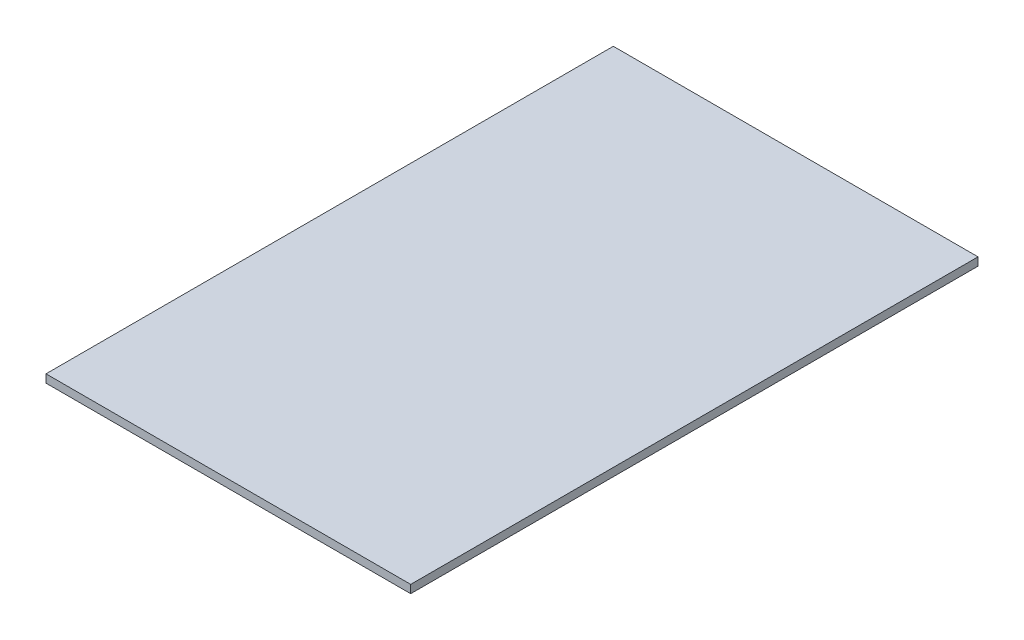
ISO-10303-21;
HEADER;
FILE_DESCRIPTION(('STEP AP214'),'2;1');
FILE_NAME('part.step','',(''),(''),'','','');
FILE_SCHEMA(('AUTOMOTIVE_DESIGN { 1 0 10303 214 1 1 1 1 }'));
ENDSEC;
DATA;
#1=APPLICATION_CONTEXT('core data for automotive mechanical design processes');
#2=APPLICATION_PROTOCOL_DEFINITION('international standard','automotive_design',2000,#1);
#3=PRODUCT_CONTEXT('',#1,'mechanical');
#4=PRODUCT('Part','Part','',(#3));
#5=PRODUCT_RELATED_PRODUCT_CATEGORY('part','',(#4));
#6=PRODUCT_DEFINITION_FORMATION('','',#4);
#7=PRODUCT_DEFINITION_CONTEXT('part definition',#1,'design');
#8=PRODUCT_DEFINITION('design','',#6,#7);
#9=PRODUCT_DEFINITION_SHAPE('','',#8);
#10=(LENGTH_UNIT() NAMED_UNIT(*) SI_UNIT(.MILLI.,.METRE.));
#11=(NAMED_UNIT(*) PLANE_ANGLE_UNIT() SI_UNIT($,.RADIAN.));
#12=(NAMED_UNIT(*) SI_UNIT($,.STERADIAN.) SOLID_ANGLE_UNIT());
#13=UNCERTAINTY_MEASURE_WITH_UNIT(LENGTH_MEASURE(1.E-05),#10,'distance_accuracy_value','');
#14=(GEOMETRIC_REPRESENTATION_CONTEXT(3) GLOBAL_UNCERTAINTY_ASSIGNED_CONTEXT((#13)) GLOBAL_UNIT_ASSIGNED_CONTEXT((#10,
#11,#12)) REPRESENTATION_CONTEXT('',''));
#15=CARTESIAN_POINT('',(0.,0.,0.));
#16=DIRECTION('',(0.,0.,1.));
#17=DIRECTION('',(1.,0.,0.));
#18=AXIS2_PLACEMENT_3D('',#15,#16,#17);
#19=CARTESIAN_POINT('',(142.875,3.175,222.25));
#20=DIRECTION('',(-1.,0.,0.));
#21=DIRECTION('',(0.,0.,1.));
#22=AXIS2_PLACEMENT_3D('',#19,#20,#21);
#23=PLANE('',#22);
#24=DIRECTION('',(0.,0.,-1.));
#25=VECTOR('',#24,1.);
#26=CARTESIAN_POINT('',(142.875,-3.175,222.25));
#27=LINE('',#26,#25);
#28=CARTESIAN_POINT('',(142.875,-3.175,222.25));
#29=VERTEX_POINT('',#28);
#30=CARTESIAN_POINT('',(142.875,-3.175,-222.25));
#31=VERTEX_POINT('',#30);
#32=EDGE_CURVE('E117',#29,#31,#27,.T.);
#33=ORIENTED_EDGE('',*,*,#32,.T.);
#34=DIRECTION('',(0.,-1.,0.));
#35=VECTOR('',#34,1.);
#36=CARTESIAN_POINT('',(142.875,3.175,-222.25));
#37=LINE('',#36,#35);
#38=CARTESIAN_POINT('',(142.875,3.175,-222.25));
#39=VERTEX_POINT('',#38);
#40=EDGE_CURVE('E11',#39,#31,#37,.T.);
#41=ORIENTED_EDGE('',*,*,#40,.F.);
#42=DIRECTION('',(0.,0.,-1.));
#43=VECTOR('',#42,1.);
#44=CARTESIAN_POINT('',(142.875,3.175,222.25));
#45=LINE('',#44,#43);
#46=CARTESIAN_POINT('',(142.875,3.175,222.25));
#47=VERTEX_POINT('',#46);
#48=EDGE_CURVE('E101',#47,#39,#45,.T.);
#49=ORIENTED_EDGE('',*,*,#48,.F.);
#50=DIRECTION('',(0.,-1.,0.));
#51=VECTOR('',#50,1.);
#52=CARTESIAN_POINT('',(142.875,3.175,222.25));
#53=LINE('',#52,#51);
#54=EDGE_CURVE('E113',#47,#29,#53,.T.);
#55=ORIENTED_EDGE('',*,*,#54,.T.);
#56=EDGE_LOOP('',(#33,#41,#49,#55));
#57=FACE_BOUND('',#56,.T.);
#58=ADVANCED_FACE('F49',(#57),#23,.F.);
#59=CARTESIAN_POINT('',(-142.875,3.175,-222.25));
#60=DIRECTION('',(0.,0.,1.));
#61=DIRECTION('',(1.,0.,0.));
#62=AXIS2_PLACEMENT_3D('',#59,#60,#61);
#63=PLANE('',#62);
#64=DIRECTION('',(-1.,0.,0.));
#65=VECTOR('',#64,1.);
#66=CARTESIAN_POINT('',(-142.875,-3.175,-222.25));
#67=LINE('',#66,#65);
#68=CARTESIAN_POINT('',(-142.875,-3.175,-222.25));
#69=VERTEX_POINT('',#68);
#70=EDGE_CURVE('E106',#31,#69,#67,.T.);
#71=ORIENTED_EDGE('',*,*,#70,.T.);
#72=DIRECTION('',(0.,-1.,0.));
#73=VECTOR('',#72,1.);
#74=CARTESIAN_POINT('',(-142.875,3.175,-222.25));
#75=LINE('',#74,#73);
#76=CARTESIAN_POINT('',(-142.875,3.175,-222.25));
#77=VERTEX_POINT('',#76);
#78=EDGE_CURVE('E58',#77,#69,#75,.T.);
#79=ORIENTED_EDGE('',*,*,#78,.F.);
#80=DIRECTION('',(-1.,0.,0.));
#81=VECTOR('',#80,1.);
#82=CARTESIAN_POINT('',(-142.875,3.175,-222.25));
#83=LINE('',#82,#81);
#84=EDGE_CURVE('E96',#39,#77,#83,.T.);
#85=ORIENTED_EDGE('',*,*,#84,.F.);
#86=ORIENTED_EDGE('',*,*,#40,.T.);
#87=EDGE_LOOP('',(#71,#79,#85,#86));
#88=FACE_BOUND('',#87,.T.);
#89=ADVANCED_FACE('F105',(#88),#63,.F.);
#90=CARTESIAN_POINT('',(-142.875,3.175,222.25));
#91=DIRECTION('',(1.,0.,0.));
#92=DIRECTION('',(0.,0.,-1.));
#93=AXIS2_PLACEMENT_3D('',#90,#91,#92);
#94=PLANE('',#93);
#95=DIRECTION('',(0.,0.,1.));
#96=VECTOR('',#95,1.);
#97=CARTESIAN_POINT('',(-142.875,-3.175,222.25));
#98=LINE('',#97,#96);
#99=CARTESIAN_POINT('',(-142.875,-3.175,222.25));
#100=VERTEX_POINT('',#99);
#101=EDGE_CURVE('E83',#69,#100,#98,.T.);
#102=ORIENTED_EDGE('',*,*,#101,.T.);
#103=DIRECTION('',(0.,-1.,0.));
#104=VECTOR('',#103,1.);
#105=CARTESIAN_POINT('',(-142.875,3.175,222.25));
#106=LINE('',#105,#104);
#107=CARTESIAN_POINT('',(-142.875,3.175,222.25));
#108=VERTEX_POINT('',#107);
#109=EDGE_CURVE('E108',#108,#100,#106,.T.);
#110=ORIENTED_EDGE('',*,*,#109,.F.);
#111=DIRECTION('',(0.,0.,1.));
#112=VECTOR('',#111,1.);
#113=CARTESIAN_POINT('',(-142.875,3.175,222.25));
#114=LINE('',#113,#112);
#115=EDGE_CURVE('E99',#77,#108,#114,.T.);
#116=ORIENTED_EDGE('',*,*,#115,.F.);
#117=ORIENTED_EDGE('',*,*,#78,.T.);
#118=EDGE_LOOP('',(#102,#110,#116,#117));
#119=FACE_BOUND('',#118,.T.);
#120=ADVANCED_FACE('F109',(#119),#94,.F.);
#121=CARTESIAN_POINT('',(-142.875,3.175,222.25));
#122=DIRECTION('',(0.,0.,-1.));
#123=DIRECTION('',(-1.,0.,0.));
#124=AXIS2_PLACEMENT_3D('',#121,#122,#123);
#125=PLANE('',#124);
#126=DIRECTION('',(1.,0.,0.));
#127=VECTOR('',#126,1.);
#128=CARTESIAN_POINT('',(-142.875,-3.175,222.25));
#129=LINE('',#128,#127);
#130=EDGE_CURVE('E89',#100,#29,#129,.T.);
#131=ORIENTED_EDGE('',*,*,#130,.T.);
#132=ORIENTED_EDGE('',*,*,#54,.F.);
#133=DIRECTION('',(1.,0.,0.));
#134=VECTOR('',#133,1.);
#135=CARTESIAN_POINT('',(-142.875,3.175,222.25));
#136=LINE('',#135,#134);
#137=EDGE_CURVE('E66',#108,#47,#136,.T.);
#138=ORIENTED_EDGE('',*,*,#137,.F.);
#139=ORIENTED_EDGE('',*,*,#109,.T.);
#140=EDGE_LOOP('',(#131,#132,#138,#139));
#141=FACE_BOUND('',#140,.T.);
#142=ADVANCED_FACE('F130',(#141),#125,.F.);
#143=CARTESIAN_POINT('',(0.,3.175,0.));
#144=DIRECTION('',(0.,-1.,0.));
#145=DIRECTION('',(0.,0.,-1.));
#146=AXIS2_PLACEMENT_3D('',#143,#144,#145);
#147=PLANE('',#146);
#148=ORIENTED_EDGE('',*,*,#48,.T.);
#149=ORIENTED_EDGE('',*,*,#84,.T.);
#150=ORIENTED_EDGE('',*,*,#115,.T.);
#151=ORIENTED_EDGE('',*,*,#137,.T.);
#152=EDGE_LOOP('',(#148,#149,#150,#151));
#153=FACE_BOUND('',#152,.T.);
#154=ADVANCED_FACE('F97',(#153),#147,.F.);
#155=CARTESIAN_POINT('',(0.,-3.175,0.));
#156=DIRECTION('',(0.,-1.,0.));
#157=DIRECTION('',(0.,0.,-1.));
#158=AXIS2_PLACEMENT_3D('',#155,#156,#157);
#159=PLANE('',#158);
#160=ORIENTED_EDGE('',*,*,#32,.F.);
#161=ORIENTED_EDGE('',*,*,#130,.F.);
#162=ORIENTED_EDGE('',*,*,#101,.F.);
#163=ORIENTED_EDGE('',*,*,#70,.F.);
#164=EDGE_LOOP('',(#160,#161,#162,#163));
#165=FACE_BOUND('',#164,.T.);
#166=ADVANCED_FACE('F133',(#165),#159,.T.);
#167=CLOSED_SHELL('',(#58,#89,#120,#142,#154,#166));
#168=MANIFOLD_SOLID_BREP('B2',#167);
#169=ADVANCED_BREP_SHAPE_REPRESENTATION('',(#18,#168),#14);
#170=SHAPE_DEFINITION_REPRESENTATION(#9,#169);
ENDSEC;
END-ISO-10303-21;
